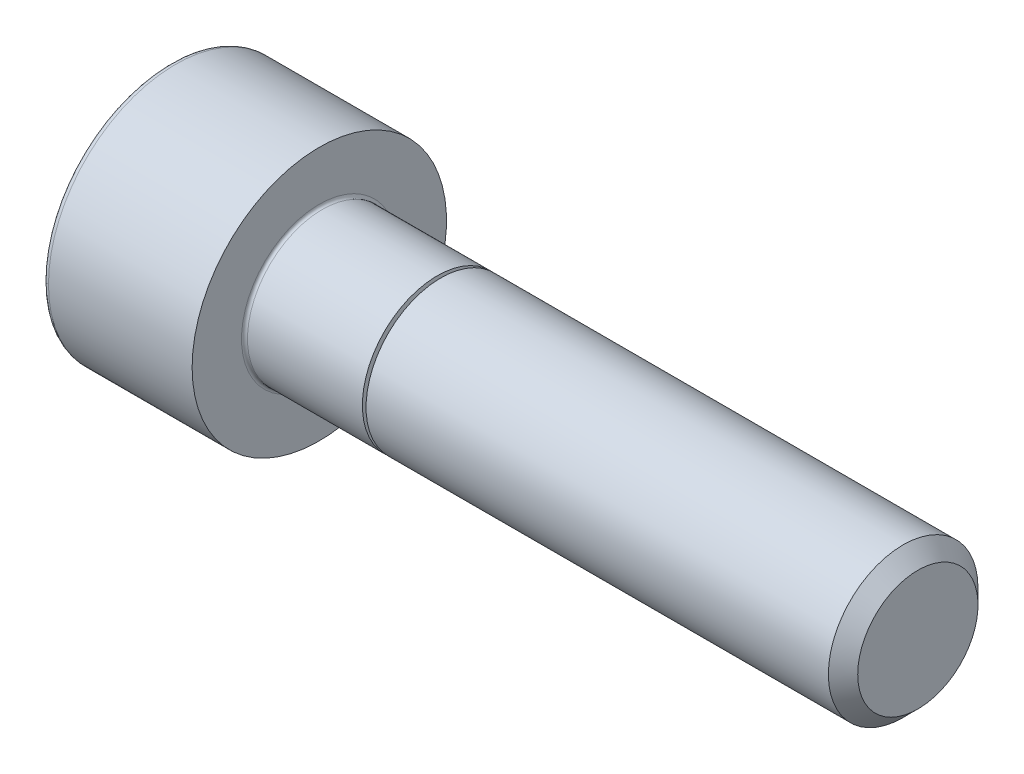
ISO-10303-21;
HEADER;
FILE_DESCRIPTION(('STEP AP214'),'2;1');
FILE_NAME('part.step','',(''),(''),'','','');
FILE_SCHEMA(('AUTOMOTIVE_DESIGN { 1 0 10303 214 1 1 1 1 }'));
ENDSEC;
DATA;
#1=APPLICATION_CONTEXT('core data for automotive mechanical design processes');
#2=APPLICATION_PROTOCOL_DEFINITION('international standard','automotive_design',2000,#1);
#3=PRODUCT_CONTEXT('',#1,'mechanical');
#4=PRODUCT('Part','Part','',(#3));
#5=PRODUCT_RELATED_PRODUCT_CATEGORY('part','',(#4));
#6=PRODUCT_DEFINITION_FORMATION('','',#4);
#7=PRODUCT_DEFINITION_CONTEXT('part definition',#1,'design');
#8=PRODUCT_DEFINITION('design','',#6,#7);
#9=PRODUCT_DEFINITION_SHAPE('','',#8);
#10=(LENGTH_UNIT() NAMED_UNIT(*) SI_UNIT(.MILLI.,.METRE.));
#11=(NAMED_UNIT(*) PLANE_ANGLE_UNIT() SI_UNIT($,.RADIAN.));
#12=(NAMED_UNIT(*) SI_UNIT($,.STERADIAN.) SOLID_ANGLE_UNIT());
#13=UNCERTAINTY_MEASURE_WITH_UNIT(LENGTH_MEASURE(1.E-05),#10,'distance_accuracy_value','');
#14=(GEOMETRIC_REPRESENTATION_CONTEXT(3) GLOBAL_UNCERTAINTY_ASSIGNED_CONTEXT((#13)) GLOBAL_UNIT_ASSIGNED_CONTEXT((#10,
#11,#12)) REPRESENTATION_CONTEXT('',''));
#15=CARTESIAN_POINT('',(0.,0.,0.));
#16=DIRECTION('',(0.,0.,1.));
#17=DIRECTION('',(1.,0.,0.));
#18=AXIS2_PLACEMENT_3D('',#15,#16,#17);
#19=CARTESIAN_POINT('',(-1.90800000001445,0.,0.));
#20=DIRECTION('',(-1.,0.,0.));
#21=DIRECTION('',(0.,-1.,0.));
#22=AXIS2_PLACEMENT_3D('',#19,#20,#21);
#23=CONICAL_SURFACE('',#22,2.32325748311268,1.04719755117676);
#24=CARTESIAN_POINT('',(-1.90000000006533,2.34860783423843E-11,-2.30940107675049));
#25=CARTESIAN_POINT('',(-1.87069554519307,0.0878878875851641,-2.25865898120469));
#26=CARTESIAN_POINT('',(-1.84404467716676,0.176534422142696,-2.20747888061372));
#27=CARTESIAN_POINT('',(-1.79752638746643,0.355362346707026,-2.10423253022681));
#28=CARTESIAN_POINT('',(-1.77767542040377,0.445546913105644,-2.05216444654021));
#29=CARTESIAN_POINT('',(-1.74677595901153,0.624798433779845,-1.94867353282659));
#30=CARTESIAN_POINT('',(-1.73552178766258,0.713837815637262,-1.89726662174263));
#31=CARTESIAN_POINT('',(-1.72208916819695,0.892335320482581,-1.79421103927044));
#32=CARTESIAN_POINT('',(-1.71989959404131,0.981792795125758,-1.7425627422042));
#33=CARTESIAN_POINT('',(-1.72446629022331,1.14893448972696,-1.64606343983341));
#34=CARTESIAN_POINT('',(-1.73010128528527,1.22664379065794,-1.60119795402236));
#35=CARTESIAN_POINT('',(-1.7479573007879,1.38155614177259,-1.51175926640552));
#36=CARTESIAN_POINT('',(-1.76018441483864,1.45875865655571,-1.46718637371336));
#37=CARTESIAN_POINT('',(-1.79074983340856,1.61399014172298,-1.37756343396534));
#38=CARTESIAN_POINT('',(-1.80921764228855,1.69199947537882,-1.33252472417983));
#39=CARTESIAN_POINT('',(-1.85113176090944,1.84685496999382,-1.24311886267837));
#40=CARTESIAN_POINT('',(-1.87456822882213,1.92370311330048,-1.19875056645355));
#41=CARTESIAN_POINT('',(-1.90000000006969,1.99999999998258,-1.15470053838931));
#42=B_SPLINE_CURVE_WITH_KNOTS('',3,(#24,#25,#26,#27,#28,#29,#30,#31,#32,#33,#34,#35,#36,#37,#38,
#39,#40,#41),.UNSPECIFIED.,.F.,.F.,(4,2,2,2,2,2,2,2,4),(0.,0.31701601155671,0.634793817026958,
0.944707606152337,1.25424088889673,1.52370778262016,1.79342419377203,2.06912162245554,
2.34427797347107),.UNSPECIFIED.);
#43=CARTESIAN_POINT('',(-1.90000000010828,-1.09039597198952E-11,-2.30940107682297));
#44=VERTEX_POINT('',#43);
#45=CARTESIAN_POINT('',(-1.9000000000726,2.,-1.15470053836919));
#46=VERTEX_POINT('',#45);
#47=EDGE_CURVE('E76',#44,#46,#42,.T.);
#48=ORIENTED_EDGE('',*,*,#47,.F.);
#49=CARTESIAN_POINT('',(-1.90000000006969,-1.99999999998258,-1.15470053838931));
#50=CARTESIAN_POINT('',(-1.87069554519536,-1.91211211241947,-1.20544263393238));
#51=CARTESIAN_POINT('',(-1.84404467716809,-1.82346557786117,-1.25662273452234));
#52=CARTESIAN_POINT('',(-1.79752638746686,-1.6446376532959,-1.35986908490872));
#53=CARTESIAN_POINT('',(-1.77767542040425,-1.55445308689711,-1.41193716859581));
#54=CARTESIAN_POINT('',(-1.74677595901191,-1.37520156622245,-1.51542808230998));
#55=CARTESIAN_POINT('',(-1.73552178766281,-1.28616218436474,-1.566834993394));
#56=CARTESIAN_POINT('',(-1.72208916819698,-1.10766467951887,-1.66989057586644));
#57=CARTESIAN_POINT('',(-1.7198995940413,-1.01820720487543,-1.72153887293286));
#58=CARTESIAN_POINT('',(-1.72446629022325,-0.851065510274214,-1.81803817530368));
#59=CARTESIAN_POINT('',(-1.73010128528516,-0.773356209343481,-1.86290366111458));
#60=CARTESIAN_POINT('',(-1.74795730078763,-0.61844385822933,-1.95234234873113));
#61=CARTESIAN_POINT('',(-1.76018441483828,-0.541241343446455,-1.99691524142314));
#62=CARTESIAN_POINT('',(-1.79074983340798,-0.386009858279664,-2.08653818117089));
#63=CARTESIAN_POINT('',(-1.80921764228784,-0.30800052462405,-2.13157689095626));
#64=CARTESIAN_POINT('',(-1.85113176090847,-0.153145030009487,-2.22098275245747));
#65=CARTESIAN_POINT('',(-1.87456822882103,-0.0762968867030372,-2.26535104868217));
#66=CARTESIAN_POINT('',(-1.90000000006845,-2.11462724692866E-11,-2.30940107674629));
#67=B_SPLINE_CURVE_WITH_KNOTS('',3,(#49,#50,#51,#52,#53,#54,#55,#56,#57,#58,#59,#60,#61,#62,#63,
#64,#65,#66),.UNSPECIFIED.,.F.,.F.,(4,2,2,2,2,2,2,2,4),(0.,0.317016011557888,0.634793817029228,
0.944707606155515,1.25424088890086,1.52370778262341,1.79342419377439,2.06912162245705,
2.34427797347178),.UNSPECIFIED.);
#68=CARTESIAN_POINT('',(-1.90000000006969,-1.99999999999129,-1.15470053837422));
#69=VERTEX_POINT('',#68);
#70=EDGE_CURVE('E93',#69,#44,#67,.T.);
#71=ORIENTED_EDGE('',*,*,#70,.F.);
#72=CARTESIAN_POINT('',(-1.90000000004994,-2.00000000003269,1.15470053836484));
#73=CARTESIAN_POINT('',(-1.87069554518889,-2.00000000001174,1.05321634727724));
#74=CARTESIAN_POINT('',(-1.84404467716728,-2.00000000000315,0.950856146097833));
#75=CARTESIAN_POINT('',(-1.79752638747041,-1.99999999999685,0.744363445327653));
#76=CARTESIAN_POINT('',(-1.77767542040649,-1.99999999999916,0.640227277955542));
#77=CARTESIAN_POINT('',(-1.746775959013,-2.00000000000081,0.433245450530546));
#78=CARTESIAN_POINT('',(-1.73552178766403,-2.00000000000022,0.330431628363774));
#79=CARTESIAN_POINT('',(-1.72208916819776,-1.99999999999978,0.124320463421629));
#80=CARTESIAN_POINT('',(-1.71989959404148,-1.99999999999995,0.0210238692902604));
#81=CARTESIAN_POINT('',(-1.7244662902223,-2.00000000000005,-0.171974735452019));
#82=CARTESIAN_POINT('',(-1.73010128528393,-2.00000000000001,-0.261705707075888));
#83=CARTESIAN_POINT('',(-1.74795730078618,-1.99999999999999,-0.440583082313188));
#84=CARTESIAN_POINT('',(-1.76018441483687,-2.,-0.529728867699324));
#85=CARTESIAN_POINT('',(-1.79074983340694,-2.,-0.708974747198913));
#86=CARTESIAN_POINT('',(-1.80921764228713,-2.,-0.799052166771626));
#87=CARTESIAN_POINT('',(-1.8511317609086,-2.,-0.97786388977785));
#88=CARTESIAN_POINT('',(-1.87456822882168,-2.,-1.06660048222909));
#89=CARTESIAN_POINT('',(-1.90000000006969,-2.,-1.15470053835913));
#90=B_SPLINE_CURVE_WITH_KNOTS('',3,(#72,#73,#74,#75,#76,#77,#78,#79,#80,#81,#82,#83,#84,#85,#86,
#87,#88,#89),.UNSPECIFIED.,.F.,.F.,(4,2,2,2,2,2,2,2,4),(0.,0.317016011552173,0.634793817018436,
0.944707606140734,1.25424088888182,1.5237077826105,1.79342419376778,2.06912162245642,
2.34427797347685),.UNSPECIFIED.);
#91=CARTESIAN_POINT('',(-1.90000000006969,-1.99999999999129,1.15470053837422));
#92=VERTEX_POINT('',#91);
#93=EDGE_CURVE('E126',#92,#69,#90,.T.);
#94=ORIENTED_EDGE('',*,*,#93,.F.);
#95=CARTESIAN_POINT('',(-1.90000000006533,-2.34854365718914E-11,2.30940107675049));
#96=CARTESIAN_POINT('',(-1.87069554519307,-0.087887887585164,2.25865898120469));
#97=CARTESIAN_POINT('',(-1.84404467716676,-0.176534422142696,2.20747888061372));
#98=CARTESIAN_POINT('',(-1.79752638746643,-0.355362346707026,2.10423253022681));
#99=CARTESIAN_POINT('',(-1.77767542040377,-0.445546913105644,2.05216444654021));
#100=CARTESIAN_POINT('',(-1.74677595901153,-0.624798433779845,1.94867353282659));
#101=CARTESIAN_POINT('',(-1.73552178766258,-0.713837815637262,1.89726662174263));
#102=CARTESIAN_POINT('',(-1.72208916819695,-0.892335320482581,1.79421103927044));
#103=CARTESIAN_POINT('',(-1.71989959404131,-0.981792795125758,1.7425627422042));
#104=CARTESIAN_POINT('',(-1.72446629022331,-1.14893448972696,1.64606343983341));
#105=CARTESIAN_POINT('',(-1.73010128528527,-1.22664379065794,1.60119795402236));
#106=CARTESIAN_POINT('',(-1.7479573007879,-1.38155614177259,1.51175926640552));
#107=CARTESIAN_POINT('',(-1.76018441483864,-1.45875865655571,1.46718637371336));
#108=CARTESIAN_POINT('',(-1.79074983340856,-1.61399014172298,1.37756343396534));
#109=CARTESIAN_POINT('',(-1.80921764228855,-1.69199947537882,1.33252472417983));
#110=CARTESIAN_POINT('',(-1.85113176090944,-1.84685496999382,1.24311886267837));
#111=CARTESIAN_POINT('',(-1.87456822882213,-1.92370311330048,1.19875056645355));
#112=CARTESIAN_POINT('',(-1.90000000006969,-1.99999999998258,1.15470053838931));
#113=B_SPLINE_CURVE_WITH_KNOTS('',3,(#95,#96,#97,#98,#99,#100,#101,#102,#103,#104,#105,#106,
#107,#108,#109,#110,#111,#112),.UNSPECIFIED.,.F.,.F.,(4,2,2,2,2,2,2,2,4),(0.,0.31701601155671,
0.634793817026958,0.944707606152336,1.25424088889673,1.52370778262016,1.79342419377203,
2.06912162245554,2.34427797347107),.UNSPECIFIED.);
#114=CARTESIAN_POINT('',(-1.90000000007986,1.09045409875299E-11,2.30940107676613));
#115=VERTEX_POINT('',#114);
#116=EDGE_CURVE('E134',#115,#92,#113,.T.);
#117=ORIENTED_EDGE('',*,*,#116,.F.);
#118=CARTESIAN_POINT('',(-1.90000000004994,2.00000000000386,1.15470053841477));
#119=CARTESIAN_POINT('',(-1.87069554518889,1.91211211242902,1.20544263394042));
#120=CARTESIAN_POINT('',(-1.84404467716728,1.82346557786687,1.25662273452269));
#121=CARTESIAN_POINT('',(-1.79752638747041,1.64463765330068,1.35986908490232));
#122=CARTESIAN_POINT('',(-1.77767542040649,1.55445308690485,1.41193716859038));
#123=CARTESIAN_POINT('',(-1.746775959013,1.3752015662339,1.51542808230431));
#124=CARTESIAN_POINT('',(-1.73552178766404,1.286162184377,1.56683499338718));
#125=CARTESIAN_POINT('',(-1.72208916819776,1.10766467953328,1.66989057585787));
#126=CARTESIAN_POINT('',(-1.71989959404148,1.01820720489118,1.7215388729237));
#127=CARTESIAN_POINT('',(-1.72446629022229,0.851065510289782,1.81803817529475));
#128=CARTESIAN_POINT('',(-1.73010128528389,0.773356209357547,1.86290366110647));
#129=CARTESIAN_POINT('',(-1.74795730078601,0.618443858240374,1.95234234872474));
#130=CARTESIAN_POINT('',(-1.76018441483661,0.541241343455978,1.99691524141764));
#131=CARTESIAN_POINT('',(-1.79074983340646,0.386009858286279,2.08653818116708));
#132=CARTESIAN_POINT('',(-1.80921764228651,0.308000524629274,2.13157689095325));
#133=CARTESIAN_POINT('',(-1.8511317609077,0.153145030012036,2.220982752456));
#134=CARTESIAN_POINT('',(-1.8745682288206,0.0762968867043,2.26535104868144));
#135=CARTESIAN_POINT('',(-1.90000000006845,2.11474228845271E-11,2.30940107674629));
#136=B_SPLINE_CURVE_WITH_KNOTS('',3,(#118,#119,#120,#121,#122,#123,#124,#125,#126,#127,#128,
#129,#130,#131,#132,#133,#134,#135),.UNSPECIFIED.,.F.,.F.,(4,2,2,2,2,2,2,2,4),(0.,
0.317016011552169,0.634793817018427,0.944707606140729,1.25424088888182,1.52370778260941,
1.7934241937656,2.06912162245308,2.34427797347237),.UNSPECIFIED.);
#137=CARTESIAN_POINT('',(-1.90000000006969,1.99999999999129,1.15470053837422));
#138=VERTEX_POINT('',#137);
#139=EDGE_CURVE('E78',#138,#115,#136,.T.);
#140=ORIENTED_EDGE('',*,*,#139,.F.);
#141=CARTESIAN_POINT('',(-1.90000000006969,2.,-1.15470053835913));
#142=CARTESIAN_POINT('',(-1.87069554519536,2.,-1.053216347273));
#143=CARTESIAN_POINT('',(-1.84404467716809,2.,-0.95085614609307));
#144=CARTESIAN_POINT('',(-1.79752638746686,2.,-0.744363445320298));
#145=CARTESIAN_POINT('',(-1.77767542040425,2.,-0.640227277946112));
#146=CARTESIAN_POINT('',(-1.74677595901191,2.,-0.433245450517777));
#147=CARTESIAN_POINT('',(-1.73552178766281,2.,-0.330431628349734));
#148=CARTESIAN_POINT('',(-1.72208916819698,2.,-0.124320463404862));
#149=CARTESIAN_POINT('',(-1.7198995940413,2.,-0.0210238692720362));
#150=CARTESIAN_POINT('',(-1.72446629022327,2.,0.171974735470407));
#151=CARTESIAN_POINT('',(-1.73010128528526,2.,0.261705707093001));
#152=CARTESIAN_POINT('',(-1.74795730078801,2.,0.440583082327695));
#153=CARTESIAN_POINT('',(-1.76018441483885,2.,0.529728867712501));
#154=CARTESIAN_POINT('',(-1.79074983340904,2.,0.708974747209597));
#155=CARTESIAN_POINT('',(-1.80921764228919,2.,0.799052166781147));
#156=CARTESIAN_POINT('',(-1.85113176091048,2.,0.977863889785148));
#157=CARTESIAN_POINT('',(-1.87456822882339,2.,1.06660048223533));
#158=CARTESIAN_POINT('',(-1.90000000007119,2.,1.15470053836433));
#159=B_SPLINE_CURVE_WITH_KNOTS('',3,(#141,#142,#143,#144,#145,#146,#147,#148,#149,#150,#151,
#152,#153,#154,#155,#156,#157,#158),.UNSPECIFIED.,.F.,.F.,(4,2,2,2,2,2,2,2,4),(0.,
0.317016011557898,0.634793817029249,0.944707606155526,1.25424088890086,1.52370778262581,
1.79342419377921,2.06912162246442,2.34427797348166),.UNSPECIFIED.);
#160=EDGE_CURVE('E19',#46,#138,#159,.T.);
#161=ORIENTED_EDGE('',*,*,#160,.F.);
#162=EDGE_LOOP('',(#48,#71,#94,#117,#140,#161));
#163=FACE_BOUND('',#162,.T.);
#164=CARTESIAN_POINT('',(-0.566666666742321,0.,-5.6843418860808E-11));
#165=VERTEX_POINT('',#164);
#166=VERTEX_LOOP('',#165);
#167=FACE_BOUND('',#166,.T.);
#168=ADVANCED_FACE('F15',(#163,#167),#23,.F.);
#169=CARTESIAN_POINT('',(0.,2.,1.15470053837925));
#170=DIRECTION('',(0.,-1.,0.));
#171=DIRECTION('',(1.,0.,0.));
#172=AXIS2_PLACEMENT_3D('',#169,#170,#171);
#173=PLANE('',#172);
#174=DIRECTION('',(0.,0.,1.));
#175=VECTOR('',#174,1.);
#176=CARTESIAN_POINT('',(-4.99999999995,2.,2.025));
#177=LINE('',#176,#175);
#178=CARTESIAN_POINT('',(-4.999999999975,2.,-1.15470053837925));
#179=VERTEX_POINT('',#178);
#180=CARTESIAN_POINT('',(-4.99999999996667,2.,1.15470053837925));
#181=VERTEX_POINT('',#180);
#182=EDGE_CURVE('E85',#179,#181,#177,.T.);
#183=ORIENTED_EDGE('',*,*,#182,.F.);
#184=DIRECTION('',(1.,0.,0.));
#185=VECTOR('',#184,1.);
#186=CARTESIAN_POINT('',(0.,2.,-1.15470053837925));
#187=LINE('',#186,#185);
#188=EDGE_CURVE('E82',#46,#179,#187,.F.);
#189=ORIENTED_EDGE('',*,*,#188,.F.);
#190=ORIENTED_EDGE('',*,*,#160,.T.);
#191=DIRECTION('',(1.,0.,0.));
#192=VECTOR('',#191,1.);
#193=CARTESIAN_POINT('',(0.,2.,1.15470053837925));
#194=LINE('',#193,#192);
#195=EDGE_CURVE('E139',#181,#138,#194,.T.);
#196=ORIENTED_EDGE('',*,*,#195,.F.);
#197=EDGE_LOOP('',(#183,#189,#190,#196));
#198=FACE_BOUND('',#197,.T.);
#199=ADVANCED_FACE('F83',(#198),#173,.T.);
#200=CARTESIAN_POINT('',(0.,0.,2.3094010767585));
#201=DIRECTION('',(0.,-0.5,-0.866025403784439));
#202=DIRECTION('',(0.,0.866025403784439,-0.5));
#203=AXIS2_PLACEMENT_3D('',#200,#201,#202);
#204=PLANE('',#203);
#205=DIRECTION('',(0.,-0.866025403784438,0.500000000000001));
#206=VECTOR('',#205,1.);
#207=CARTESIAN_POINT('',(-4.99999999995,2.,1.15470053837925));
#208=LINE('',#207,#206);
#209=CARTESIAN_POINT('',(-4.999999999975,0.,2.3094010767585));
#210=VERTEX_POINT('',#209);
#211=EDGE_CURVE('E271',#181,#210,#208,.T.);
#212=ORIENTED_EDGE('',*,*,#211,.F.);
#213=ORIENTED_EDGE('',*,*,#195,.T.);
#214=ORIENTED_EDGE('',*,*,#139,.T.);
#215=DIRECTION('',(1.,0.,0.));
#216=VECTOR('',#215,1.);
#217=CARTESIAN_POINT('',(0.,0.,2.3094010767585));
#218=LINE('',#217,#216);
#219=EDGE_CURVE('E133',#210,#115,#218,.T.);
#220=ORIENTED_EDGE('',*,*,#219,.F.);
#221=EDGE_LOOP('',(#212,#213,#214,#220));
#222=FACE_BOUND('',#221,.T.);
#223=ADVANCED_FACE('F143',(#222),#204,.T.);
#224=CARTESIAN_POINT('',(0.,-2.,1.15470053837925));
#225=DIRECTION('',(0.,0.5,-0.866025403784438));
#226=DIRECTION('',(0.,0.866025403784438,0.5));
#227=AXIS2_PLACEMENT_3D('',#224,#225,#226);
#228=PLANE('',#227);
#229=DIRECTION('',(0.,-0.866025403784439,-0.5));
#230=VECTOR('',#229,1.);
#231=CARTESIAN_POINT('',(-4.99999999995,0.,2.3094010767585));
#232=LINE('',#231,#230);
#233=CARTESIAN_POINT('',(-4.999999999975,-2.,1.15470053837925));
#234=VERTEX_POINT('',#233);
#235=EDGE_CURVE('E276',#210,#234,#232,.T.);
#236=ORIENTED_EDGE('',*,*,#235,.F.);
#237=ORIENTED_EDGE('',*,*,#219,.T.);
#238=ORIENTED_EDGE('',*,*,#116,.T.);
#239=DIRECTION('',(1.,0.,0.));
#240=VECTOR('',#239,1.);
#241=CARTESIAN_POINT('',(0.,-2.,1.15470053837925));
#242=LINE('',#241,#240);
#243=EDGE_CURVE('E132',#234,#92,#242,.T.);
#244=ORIENTED_EDGE('',*,*,#243,.F.);
#245=EDGE_LOOP('',(#236,#237,#238,#244));
#246=FACE_BOUND('',#245,.T.);
#247=ADVANCED_FACE('F122',(#246),#228,.T.);
#248=CARTESIAN_POINT('',(0.,-2.,-1.15470053837925));
#249=DIRECTION('',(0.,1.,0.));
#250=DIRECTION('',(0.,0.,1.));
#251=AXIS2_PLACEMENT_3D('',#248,#249,#250);
#252=PLANE('',#251);
#253=DIRECTION('',(0.,0.,1.));
#254=VECTOR('',#253,1.);
#255=CARTESIAN_POINT('',(-4.99999999995,-2.,2.025));
#256=LINE('',#255,#254);
#257=CARTESIAN_POINT('',(-4.999999999975,-2.,-1.15470053837925));
#258=VERTEX_POINT('',#257);
#259=EDGE_CURVE('E267',#234,#258,#256,.F.);
#260=ORIENTED_EDGE('',*,*,#259,.F.);
#261=ORIENTED_EDGE('',*,*,#243,.T.);
#262=ORIENTED_EDGE('',*,*,#93,.T.);
#263=DIRECTION('',(1.,0.,0.));
#264=VECTOR('',#263,1.);
#265=CARTESIAN_POINT('',(0.,-2.,-1.15470053837925));
#266=LINE('',#265,#264);
#267=EDGE_CURVE('E90',#258,#69,#266,.T.);
#268=ORIENTED_EDGE('',*,*,#267,.F.);
#269=EDGE_LOOP('',(#260,#261,#262,#268));
#270=FACE_BOUND('',#269,.T.);
#271=ADVANCED_FACE('F118',(#270),#252,.T.);
#272=CARTESIAN_POINT('',(0.,0.,-2.3094010767585));
#273=DIRECTION('',(0.,0.5,0.866025403784439));
#274=DIRECTION('',(0.,-0.866025403784439,0.5));
#275=AXIS2_PLACEMENT_3D('',#272,#273,#274);
#276=PLANE('',#275);
#277=DIRECTION('',(0.,0.866025403784438,-0.5));
#278=VECTOR('',#277,1.);
#279=CARTESIAN_POINT('',(-4.99999999995,-2.,-1.15470053837925));
#280=LINE('',#279,#278);
#281=CARTESIAN_POINT('',(-5.,0.,-2.3094010767585));
#282=VERTEX_POINT('',#281);
#283=EDGE_CURVE('E262',#258,#282,#280,.T.);
#284=ORIENTED_EDGE('',*,*,#283,.F.);
#285=ORIENTED_EDGE('',*,*,#267,.T.);
#286=ORIENTED_EDGE('',*,*,#70,.T.);
#287=DIRECTION('',(1.,0.,0.));
#288=VECTOR('',#287,1.);
#289=CARTESIAN_POINT('',(0.,0.,-2.3094010767585));
#290=LINE('',#289,#288);
#291=EDGE_CURVE('E37',#282,#44,#290,.T.);
#292=ORIENTED_EDGE('',*,*,#291,.F.);
#293=EDGE_LOOP('',(#284,#285,#286,#292));
#294=FACE_BOUND('',#293,.T.);
#295=ADVANCED_FACE('F112',(#294),#276,.T.);
#296=CARTESIAN_POINT('',(0.,2.,-1.15470053837925));
#297=DIRECTION('',(0.,-0.500000000000001,0.866025403784438));
#298=DIRECTION('',(0.,-0.866025403784438,-0.500000000000001));
#299=AXIS2_PLACEMENT_3D('',#296,#297,#298);
#300=PLANE('',#299);
#301=DIRECTION('',(0.,0.866025403784439,0.5));
#302=VECTOR('',#301,1.);
#303=CARTESIAN_POINT('',(-4.99999999995,0.,-2.3094010767585));
#304=LINE('',#303,#302);
#305=EDGE_CURVE('E260',#282,#179,#304,.T.);
#306=ORIENTED_EDGE('',*,*,#305,.F.);
#307=ORIENTED_EDGE('',*,*,#291,.T.);
#308=ORIENTED_EDGE('',*,*,#47,.T.);
#309=ORIENTED_EDGE('',*,*,#188,.T.);
#310=EDGE_LOOP('',(#306,#307,#308,#309));
#311=FACE_BOUND('',#310,.T.);
#312=ADVANCED_FACE('F89',(#311),#300,.T.);
#313=CARTESIAN_POINT('',(-4.99999999995,0.,2.025));
#314=DIRECTION('',(-1.,0.,0.));
#315=DIRECTION('',(0.,0.,1.));
#316=AXIS2_PLACEMENT_3D('',#313,#314,#315);
#317=PLANE('',#316);
#318=ORIENTED_EDGE('',*,*,#283,.T.);
#319=ORIENTED_EDGE('',*,*,#305,.T.);
#320=ORIENTED_EDGE('',*,*,#182,.T.);
#321=ORIENTED_EDGE('',*,*,#211,.T.);
#322=ORIENTED_EDGE('',*,*,#235,.T.);
#323=ORIENTED_EDGE('',*,*,#259,.T.);
#324=EDGE_LOOP('',(#318,#319,#320,#321,#322,#323));
#325=FACE_BOUND('',#324,.T.);
#326=CARTESIAN_POINT('',(-4.9999999999,0.,0.));
#327=DIRECTION('',(1.,0.,0.));
#328=DIRECTION('',(0.,0.,1.));
#329=AXIS2_PLACEMENT_3D('',#326,#327,#328);
#330=CIRCLE('',#329,4.05);
#331=CARTESIAN_POINT('',(-4.9999999999,0.,4.05));
#332=VERTEX_POINT('',#331);
#333=EDGE_CURVE('E221',#332,#332,#330,.T.);
#334=ORIENTED_EDGE('',*,*,#333,.F.);
#335=EDGE_LOOP('',(#334));
#336=FACE_BOUND('',#335,.T.);
#337=ADVANCED_FACE('F111',(#325,#336),#317,.T.);
#338=CARTESIAN_POINT('',(-4.7999999999,0.,0.));
#339=DIRECTION('',(-1.,0.,0.));
#340=DIRECTION('',(0.,0.,1.));
#341=AXIS2_PLACEMENT_3D('',#338,#339,#340);
#342=TOROIDAL_SURFACE('',#341,4.0499999999,0.200000000000002);
#343=CARTESIAN_POINT('',(-4.8,0.,0.));
#344=DIRECTION('',(-1.,0.,0.));
#345=DIRECTION('',(0.,0.,1.));
#346=AXIS2_PLACEMENT_3D('',#343,#344,#345);
#347=CIRCLE('',#346,4.25);
#348=CARTESIAN_POINT('',(-4.8,0.,4.25));
#349=VERTEX_POINT('',#348);
#350=EDGE_CURVE('E213',#349,#349,#347,.F.);
#351=ORIENTED_EDGE('',*,*,#350,.F.);
#352=EDGE_LOOP('',(#351));
#353=FACE_BOUND('',#352,.T.);
#354=ORIENTED_EDGE('',*,*,#333,.T.);
#355=EDGE_LOOP('',(#354));
#356=FACE_BOUND('',#355,.T.);
#357=ADVANCED_FACE('F226',(#353,#356),#342,.T.);
#358=CARTESIAN_POINT('',(-2.4,0.,0.));
#359=DIRECTION('',(-1.,0.,0.));
#360=DIRECTION('',(0.,0.,1.));
#361=AXIS2_PLACEMENT_3D('',#358,#359,#360);
#362=CYLINDRICAL_SURFACE('',#361,4.25);
#363=ORIENTED_EDGE('',*,*,#350,.T.);
#364=EDGE_LOOP('',(#363));
#365=FACE_BOUND('',#364,.T.);
#366=CARTESIAN_POINT('',(0.,0.,0.));
#367=DIRECTION('',(-1.,0.,0.));
#368=DIRECTION('',(0.,0.,1.));
#369=AXIS2_PLACEMENT_3D('',#366,#367,#368);
#370=CIRCLE('',#369,4.25);
#371=CARTESIAN_POINT('',(0.,0.,4.25));
#372=VERTEX_POINT('',#371);
#373=EDGE_CURVE('E101',#372,#372,#370,.F.);
#374=ORIENTED_EDGE('',*,*,#373,.F.);
#375=EDGE_LOOP('',(#374));
#376=FACE_BOUND('',#375,.T.);
#377=ADVANCED_FACE('F229',(#365,#376),#362,.T.);
#378=CARTESIAN_POINT('',(0.,0.,2.125));
#379=DIRECTION('',(1.,0.,0.));
#380=DIRECTION('',(0.,1.,0.));
#381=AXIS2_PLACEMENT_3D('',#378,#379,#380);
#382=PLANE('',#381);
#383=CARTESIAN_POINT('',(0.,0.,0.));
#384=DIRECTION('',(1.,0.,0.));
#385=DIRECTION('',(0.,0.,-1.));
#386=AXIS2_PLACEMENT_3D('',#383,#384,#385);
#387=CIRCLE('',#386,2.6);
#388=CARTESIAN_POINT('',(0.,0.,-2.6));
#389=VERTEX_POINT('',#388);
#390=EDGE_CURVE('E201',#389,#389,#387,.T.);
#391=ORIENTED_EDGE('',*,*,#390,.F.);
#392=EDGE_LOOP('',(#391));
#393=FACE_BOUND('',#392,.T.);
#394=ORIENTED_EDGE('',*,*,#373,.T.);
#395=EDGE_LOOP('',(#394));
#396=FACE_BOUND('',#395,.T.);
#397=ADVANCED_FACE('F187',(#393,#396),#382,.T.);
#398=CARTESIAN_POINT('',(0.1,0.,0.));
#399=DIRECTION('',(1.,0.,0.));
#400=DIRECTION('',(0.,0.,-1.));
#401=AXIS2_PLACEMENT_3D('',#398,#399,#400);
#402=TOROIDAL_SURFACE('',#401,2.6,0.1);
#403=ORIENTED_EDGE('',*,*,#390,.T.);
#404=EDGE_LOOP('',(#403));
#405=FACE_BOUND('',#404,.T.);
#406=CARTESIAN_POINT('',(0.1,0.,0.));
#407=DIRECTION('',(1.,0.,0.));
#408=DIRECTION('',(0.,0.,-1.));
#409=AXIS2_PLACEMENT_3D('',#406,#407,#408);
#410=CIRCLE('',#409,2.5);
#411=CARTESIAN_POINT('',(0.1,0.,-2.5));
#412=VERTEX_POINT('',#411);
#413=EDGE_CURVE('E195',#412,#412,#410,.T.);
#414=ORIENTED_EDGE('',*,*,#413,.F.);
#415=EDGE_LOOP('',(#414));
#416=FACE_BOUND('',#415,.T.);
#417=ADVANCED_FACE('F181',(#405,#416),#402,.F.);
#418=CARTESIAN_POINT('',(2.05,0.,0.));
#419=DIRECTION('',(1.,0.,0.));
#420=DIRECTION('',(0.,0.,-1.));
#421=AXIS2_PLACEMENT_3D('',#418,#419,#420);
#422=CYLINDRICAL_SURFACE('',#421,2.5);
#423=CARTESIAN_POINT('',(3.93868749999626,0.,0.));
#424=DIRECTION('',(-1.,0.,0.));
#425=DIRECTION('',(0.,0.,-1.));
#426=AXIS2_PLACEMENT_3D('',#423,#424,#425);
#427=CIRCLE('',#426,2.49999999999773);
#428=CARTESIAN_POINT('',(3.93868749999626,0.,-2.49999999999773));
#429=VERTEX_POINT('',#428);
#430=EDGE_CURVE('E289',#429,#429,#427,.T.);
#431=ORIENTED_EDGE('',*,*,#430,.T.);
#432=EDGE_LOOP('',(#431));
#433=FACE_BOUND('',#432,.T.);
#434=ORIENTED_EDGE('',*,*,#413,.T.);
#435=EDGE_LOOP('',(#434));
#436=FACE_BOUND('',#435,.T.);
#437=ADVANCED_FACE('F177',(#433,#436),#422,.T.);
#438=CARTESIAN_POINT('',(20.,0.,-1.25));
#439=DIRECTION('',(1.,0.,0.));
#440=DIRECTION('',(0.,0.,-1.));
#441=AXIS2_PLACEMENT_3D('',#438,#439,#440);
#442=PLANE('',#441);
#443=CARTESIAN_POINT('',(19.9999999999818,0.,0.));
#444=DIRECTION('',(-1.,0.,0.));
#445=DIRECTION('',(0.,0.,1.));
#446=AXIS2_PLACEMENT_3D('',#443,#444,#445);
#447=CIRCLE('',#446,2.00950000009925);
#448=CARTESIAN_POINT('',(19.9999999999818,0.,2.00950000009925));
#449=VERTEX_POINT('',#448);
#450=EDGE_CURVE('E286',#449,#449,#447,.F.);
#451=ORIENTED_EDGE('',*,*,#450,.T.);
#452=EDGE_LOOP('',(#451));
#453=FACE_BOUND('',#452,.T.);
#454=ADVANCED_FACE('F173',(#453),#442,.T.);
#455=CARTESIAN_POINT('',(4.0000000000191,0.,0.));
#456=DIRECTION('',(-1.,0.,0.));
#457=DIRECTION('',(0.,0.,1.));
#458=AXIS2_PLACEMENT_3D('',#455,#456,#457);
#459=CONICAL_SURFACE('',#458,2.00949999981503,1.44644133224814);
#460=ORIENTED_EDGE('',*,*,#430,.F.);
#461=EDGE_LOOP('',(#460));
#462=FACE_BOUND('',#461,.T.);
#463=CARTESIAN_POINT('',(3.99999999999778,0.,0.));
#464=DIRECTION('',(1.,0.,0.));
#465=DIRECTION('',(0.,0.,-1.));
#466=AXIS2_PLACEMENT_3D('',#463,#464,#465);
#467=CIRCLE('',#466,2.00949999998556);
#468=CARTESIAN_POINT('',(3.99999999999778,0.,-2.00949999998556));
#469=VERTEX_POINT('',#468);
#470=EDGE_CURVE('E288',#469,#469,#467,.F.);
#471=ORIENTED_EDGE('',*,*,#470,.T.);
#472=EDGE_LOOP('',(#471));
#473=FACE_BOUND('',#472,.T.);
#474=ADVANCED_FACE('F169',(#462,#473),#459,.T.);
#475=CARTESIAN_POINT('',(20.0000000002092,0.,0.));
#476=DIRECTION('',(-1.,0.,0.));
#477=DIRECTION('',(0.,0.,1.));
#478=AXIS2_PLACEMENT_3D('',#475,#476,#477);
#479=CONICAL_SURFACE('',#478,2.00949999987188,0.785398163397448);
#480=CARTESIAN_POINT('',(19.5095,0.,0.));
#481=DIRECTION('',(1.,0.,0.));
#482=DIRECTION('',(0.,0.,-1.));
#483=AXIS2_PLACEMENT_3D('',#480,#481,#482);
#484=CIRCLE('',#483,2.5);
#485=CARTESIAN_POINT('',(19.5095,0.,-2.5));
#486=VERTEX_POINT('',#485);
#487=EDGE_CURVE('E28',#486,#486,#484,.F.);
#488=ORIENTED_EDGE('',*,*,#487,.F.);
#489=EDGE_LOOP('',(#488));
#490=FACE_BOUND('',#489,.T.);
#491=ORIENTED_EDGE('',*,*,#450,.F.);
#492=EDGE_LOOP('',(#491));
#493=FACE_BOUND('',#492,.T.);
#494=ADVANCED_FACE('F161',(#490,#493),#479,.T.);
#495=CARTESIAN_POINT('',(3.99999999998357,0.,0.));
#496=DIRECTION('',(1.,0.,0.));
#497=DIRECTION('',(0.,0.,-1.));
#498=AXIS2_PLACEMENT_3D('',#495,#496,#497);
#499=CONICAL_SURFACE('',#498,2.00949999987188,1.44644133224814);
#500=ORIENTED_EDGE('',*,*,#470,.F.);
#501=EDGE_LOOP('',(#500));
#502=FACE_BOUND('',#501,.T.);
#503=CARTESIAN_POINT('',(4.0613125,0.,0.));
#504=DIRECTION('',(1.,0.,0.));
#505=DIRECTION('',(0.,0.,-1.));
#506=AXIS2_PLACEMENT_3D('',#503,#504,#505);
#507=CIRCLE('',#506,2.5);
#508=CARTESIAN_POINT('',(4.0613125,0.,-2.5));
#509=VERTEX_POINT('',#508);
#510=EDGE_CURVE('E9',#509,#509,#507,.T.);
#511=ORIENTED_EDGE('',*,*,#510,.F.);
#512=EDGE_LOOP('',(#511));
#513=FACE_BOUND('',#512,.T.);
#514=ADVANCED_FACE('F155',(#502,#513),#499,.T.);
#515=CARTESIAN_POINT('',(2.05,0.,0.));
#516=DIRECTION('',(1.,0.,0.));
#517=DIRECTION('',(0.,0.,-1.));
#518=AXIS2_PLACEMENT_3D('',#515,#516,#517);
#519=CYLINDRICAL_SURFACE('',#518,2.5);
#520=ORIENTED_EDGE('',*,*,#487,.T.);
#521=EDGE_LOOP('',(#520));
#522=FACE_BOUND('',#521,.T.);
#523=ORIENTED_EDGE('',*,*,#510,.T.);
#524=EDGE_LOOP('',(#523));
#525=FACE_BOUND('',#524,.T.);
#526=ADVANCED_FACE('F153',(#522,#525),#519,.T.);
#527=CLOSED_SHELL('',(#168,#199,#223,#247,#271,#295,#312,#337,#357,#377,#397,#417,#437,#454,
#474,#494,#514,#526));
#528=MANIFOLD_SOLID_BREP('B1',#527);
#529=ADVANCED_BREP_SHAPE_REPRESENTATION('',(#18,#528),#14);
#530=SHAPE_DEFINITION_REPRESENTATION(#9,#529);
ENDSEC;
END-ISO-10303-21;
